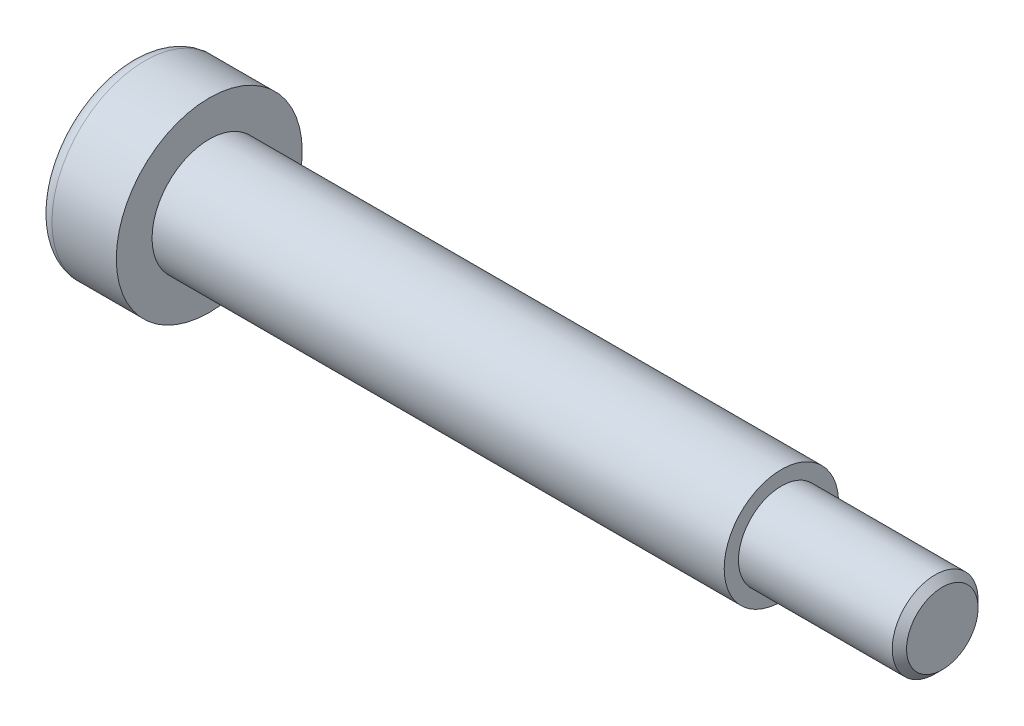
ISO-10303-21;
HEADER;
FILE_DESCRIPTION(('STEP AP214'),'2;1');
FILE_NAME('part.step','',(''),(''),'','','');
FILE_SCHEMA(('AUTOMOTIVE_DESIGN { 1 0 10303 214 1 1 1 1 }'));
ENDSEC;
DATA;
#1=APPLICATION_CONTEXT('core data for automotive mechanical design processes');
#2=APPLICATION_PROTOCOL_DEFINITION('international standard','automotive_design',2000,#1);
#3=PRODUCT_CONTEXT('',#1,'mechanical');
#4=PRODUCT('Part','Part','',(#3));
#5=PRODUCT_RELATED_PRODUCT_CATEGORY('part','',(#4));
#6=PRODUCT_DEFINITION_FORMATION('','',#4);
#7=PRODUCT_DEFINITION_CONTEXT('part definition',#1,'design');
#8=PRODUCT_DEFINITION('design','',#6,#7);
#9=PRODUCT_DEFINITION_SHAPE('','',#8);
#10=(LENGTH_UNIT() NAMED_UNIT(*) SI_UNIT(.MILLI.,.METRE.));
#11=(NAMED_UNIT(*) PLANE_ANGLE_UNIT() SI_UNIT($,.RADIAN.));
#12=(NAMED_UNIT(*) SI_UNIT($,.STERADIAN.) SOLID_ANGLE_UNIT());
#13=UNCERTAINTY_MEASURE_WITH_UNIT(LENGTH_MEASURE(1.E-05),#10,'distance_accuracy_value','');
#14=(GEOMETRIC_REPRESENTATION_CONTEXT(3) GLOBAL_UNCERTAINTY_ASSIGNED_CONTEXT((#13)) GLOBAL_UNIT_ASSIGNED_CONTEXT((#10,
#11,#12)) REPRESENTATION_CONTEXT('',''));
#15=CARTESIAN_POINT('',(0.,0.,0.));
#16=DIRECTION('',(0.,0.,1.));
#17=DIRECTION('',(1.,0.,0.));
#18=AXIS2_PLACEMENT_3D('',#15,#16,#17);
#19=CARTESIAN_POINT('',(0.,0.,0.));
#20=DIRECTION('',(1.,0.,0.));
#21=DIRECTION('',(0.,0.,-1.));
#22=AXIS2_PLACEMENT_3D('',#19,#20,#21);
#23=PLANE('',#22);
#24=CARTESIAN_POINT('',(0.,0.,0.));
#25=DIRECTION('',(1.,0.,0.));
#26=DIRECTION('',(0.,0.,-1.));
#27=AXIS2_PLACEMENT_3D('',#24,#25,#26);
#28=CIRCLE('',#27,5.5);
#29=CARTESIAN_POINT('',(0.,0.,-5.5));
#30=VERTEX_POINT('',#29);
#31=EDGE_CURVE('E164',#30,#30,#28,.F.);
#32=ORIENTED_EDGE('',*,*,#31,.T.);
#33=EDGE_LOOP('',(#32));
#34=FACE_BOUND('',#33,.T.);
#35=DIRECTION('',(0.,-0.5,-0.866025403784439));
#36=VECTOR('',#35,1.);
#37=CARTESIAN_POINT('',(0.,2.3094010767585,0.));
#38=LINE('',#37,#36);
#39=CARTESIAN_POINT('',(0.,2.3094010767585,0.));
#40=VERTEX_POINT('',#39);
#41=CARTESIAN_POINT('',(0.,1.15470053837925,-2.));
#42=VERTEX_POINT('',#41);
#43=EDGE_CURVE('E134',#40,#42,#38,.T.);
#44=ORIENTED_EDGE('',*,*,#43,.F.);
#45=DIRECTION('',(0.,0.5,-0.866025403784439));
#46=VECTOR('',#45,1.);
#47=CARTESIAN_POINT('',(0.,1.15470053837925,2.));
#48=LINE('',#47,#46);
#49=CARTESIAN_POINT('',(0.,1.15470053837925,2.));
#50=VERTEX_POINT('',#49);
#51=EDGE_CURVE('E60',#50,#40,#48,.T.);
#52=ORIENTED_EDGE('',*,*,#51,.F.);
#53=DIRECTION('',(0.,1.,0.));
#54=VECTOR('',#53,1.);
#55=CARTESIAN_POINT('',(0.,-1.15470053837925,2.));
#56=LINE('',#55,#54);
#57=CARTESIAN_POINT('',(0.,-1.15470053837925,2.));
#58=VERTEX_POINT('',#57);
#59=EDGE_CURVE('E143',#58,#50,#56,.T.);
#60=ORIENTED_EDGE('',*,*,#59,.F.);
#61=DIRECTION('',(0.,0.5,0.866025403784439));
#62=VECTOR('',#61,1.);
#63=CARTESIAN_POINT('',(0.,-2.3094010767585,0.));
#64=LINE('',#63,#62);
#65=CARTESIAN_POINT('',(0.,-2.3094010767585,0.));
#66=VERTEX_POINT('',#65);
#67=EDGE_CURVE('E141',#66,#58,#64,.T.);
#68=ORIENTED_EDGE('',*,*,#67,.F.);
#69=DIRECTION('',(0.,-0.5,0.866025403784439));
#70=VECTOR('',#69,1.);
#71=CARTESIAN_POINT('',(0.,-1.15470053837925,-2.));
#72=LINE('',#71,#70);
#73=CARTESIAN_POINT('',(0.,-1.15470053837925,-2.));
#74=VERTEX_POINT('',#73);
#75=EDGE_CURVE('E108',#74,#66,#72,.T.);
#76=ORIENTED_EDGE('',*,*,#75,.F.);
#77=DIRECTION('',(0.,-1.,0.));
#78=VECTOR('',#77,1.);
#79=CARTESIAN_POINT('',(0.,1.15470053837925,-2.));
#80=LINE('',#79,#78);
#81=EDGE_CURVE('E137',#42,#74,#80,.T.);
#82=ORIENTED_EDGE('',*,*,#81,.F.);
#83=EDGE_LOOP('',(#44,#52,#60,#68,#76,#82));
#84=FACE_BOUND('',#83,.T.);
#85=ADVANCED_FACE('F45',(#34,#84),#23,.F.);
#86=CARTESIAN_POINT('',(0.,0.,0.));
#87=DIRECTION('',(-1.,0.,0.));
#88=DIRECTION('',(0.,0.,1.));
#89=AXIS2_PLACEMENT_3D('',#86,#87,#88);
#90=CYLINDRICAL_SURFACE('',#89,6.5);
#91=CARTESIAN_POINT('',(1.,0.,0.));
#92=DIRECTION('',(1.,0.,0.));
#93=DIRECTION('',(0.,0.,-1.));
#94=AXIS2_PLACEMENT_3D('',#91,#92,#93);
#95=CIRCLE('',#94,6.5);
#96=CARTESIAN_POINT('',(1.,0.,-6.5));
#97=VERTEX_POINT('',#96);
#98=EDGE_CURVE('E167',#97,#97,#95,.T.);
#99=ORIENTED_EDGE('',*,*,#98,.T.);
#100=EDGE_LOOP('',(#99));
#101=FACE_BOUND('',#100,.T.);
#102=CARTESIAN_POINT('',(5.5,0.,0.));
#103=DIRECTION('',(-1.,0.,0.));
#104=DIRECTION('',(0.,0.,1.));
#105=AXIS2_PLACEMENT_3D('',#102,#103,#104);
#106=CIRCLE('',#105,6.5);
#107=CARTESIAN_POINT('',(5.5,0.,6.5));
#108=VERTEX_POINT('',#107);
#109=EDGE_CURVE('E161',#108,#108,#106,.T.);
#110=ORIENTED_EDGE('',*,*,#109,.T.);
#111=EDGE_LOOP('',(#110));
#112=FACE_BOUND('',#111,.T.);
#113=ADVANCED_FACE('F185',(#101,#112),#90,.T.);
#114=CARTESIAN_POINT('',(5.5,6.5,0.));
#115=DIRECTION('',(-1.,0.,0.));
#116=DIRECTION('',(0.,0.,1.));
#117=AXIS2_PLACEMENT_3D('',#114,#115,#116);
#118=PLANE('',#117);
#119=ORIENTED_EDGE('',*,*,#109,.F.);
#120=EDGE_LOOP('',(#119));
#121=FACE_BOUND('',#120,.T.);
#122=CARTESIAN_POINT('',(5.5,0.,0.));
#123=DIRECTION('',(-1.,0.,0.));
#124=DIRECTION('',(0.,0.,1.));
#125=AXIS2_PLACEMENT_3D('',#122,#123,#124);
#126=CIRCLE('',#125,4.);
#127=CARTESIAN_POINT('',(5.5,0.,4.));
#128=VERTEX_POINT('',#127);
#129=EDGE_CURVE('E158',#128,#128,#126,.T.);
#130=ORIENTED_EDGE('',*,*,#129,.T.);
#131=EDGE_LOOP('',(#130));
#132=FACE_BOUND('',#131,.T.);
#133=ADVANCED_FACE('F192',(#121,#132),#118,.F.);
#134=CARTESIAN_POINT('',(0.,0.,0.));
#135=DIRECTION('',(-1.,0.,0.));
#136=DIRECTION('',(0.,0.,1.));
#137=AXIS2_PLACEMENT_3D('',#134,#135,#136);
#138=CYLINDRICAL_SURFACE('',#137,4.);
#139=ORIENTED_EDGE('',*,*,#129,.F.);
#140=EDGE_LOOP('',(#139));
#141=FACE_BOUND('',#140,.T.);
#142=CARTESIAN_POINT('',(45.5,0.,0.));
#143=DIRECTION('',(-1.,0.,0.));
#144=DIRECTION('',(0.,0.,1.));
#145=AXIS2_PLACEMENT_3D('',#142,#143,#144);
#146=CIRCLE('',#145,4.);
#147=CARTESIAN_POINT('',(45.5,0.,4.));
#148=VERTEX_POINT('',#147);
#149=EDGE_CURVE('E155',#148,#148,#146,.T.);
#150=ORIENTED_EDGE('',*,*,#149,.T.);
#151=EDGE_LOOP('',(#150));
#152=FACE_BOUND('',#151,.T.);
#153=ADVANCED_FACE('F199',(#141,#152),#138,.T.);
#154=CARTESIAN_POINT('',(45.5,4.,0.));
#155=DIRECTION('',(-1.,0.,0.));
#156=DIRECTION('',(0.,0.,1.));
#157=AXIS2_PLACEMENT_3D('',#154,#155,#156);
#158=PLANE('',#157);
#159=ORIENTED_EDGE('',*,*,#149,.F.);
#160=EDGE_LOOP('',(#159));
#161=FACE_BOUND('',#160,.T.);
#162=CARTESIAN_POINT('',(45.5,0.,0.));
#163=DIRECTION('',(-1.,0.,0.));
#164=DIRECTION('',(0.,0.,1.));
#165=AXIS2_PLACEMENT_3D('',#162,#163,#164);
#166=CIRCLE('',#165,3.);
#167=CARTESIAN_POINT('',(45.5,0.,3.));
#168=VERTEX_POINT('',#167);
#169=EDGE_CURVE('E147',#168,#168,#166,.T.);
#170=ORIENTED_EDGE('',*,*,#169,.T.);
#171=EDGE_LOOP('',(#170));
#172=FACE_BOUND('',#171,.T.);
#173=ADVANCED_FACE('F203',(#161,#172),#158,.F.);
#174=CARTESIAN_POINT('',(0.,0.,0.));
#175=DIRECTION('',(-1.,0.,0.));
#176=DIRECTION('',(0.,0.,1.));
#177=AXIS2_PLACEMENT_3D('',#174,#175,#176);
#178=CYLINDRICAL_SURFACE('',#177,3.);
#179=CARTESIAN_POINT('',(56.25,0.,0.));
#180=DIRECTION('',(-1.,0.,0.));
#181=DIRECTION('',(0.,0.,1.));
#182=AXIS2_PLACEMENT_3D('',#179,#180,#181);
#183=CIRCLE('',#182,3.);
#184=CARTESIAN_POINT('',(56.25,0.,3.));
#185=VERTEX_POINT('',#184);
#186=EDGE_CURVE('E53',#185,#185,#183,.T.);
#187=ORIENTED_EDGE('',*,*,#186,.T.);
#188=EDGE_LOOP('',(#187));
#189=FACE_BOUND('',#188,.T.);
#190=ORIENTED_EDGE('',*,*,#169,.F.);
#191=EDGE_LOOP('',(#190));
#192=FACE_BOUND('',#191,.T.);
#193=ADVANCED_FACE('F172',(#189,#192),#178,.T.);
#194=CARTESIAN_POINT('',(56.75,3.,0.));
#195=DIRECTION('',(-1.,0.,0.));
#196=DIRECTION('',(0.,0.,1.));
#197=AXIS2_PLACEMENT_3D('',#194,#195,#196);
#198=PLANE('',#197);
#199=CARTESIAN_POINT('',(56.75,0.,0.));
#200=DIRECTION('',(-1.,0.,0.));
#201=DIRECTION('',(0.,0.,1.));
#202=AXIS2_PLACEMENT_3D('',#199,#200,#201);
#203=CIRCLE('',#202,2.5);
#204=CARTESIAN_POINT('',(56.75,0.,2.5));
#205=VERTEX_POINT('',#204);
#206=EDGE_CURVE('E11',#205,#205,#203,.F.);
#207=ORIENTED_EDGE('',*,*,#206,.T.);
#208=EDGE_LOOP('',(#207));
#209=FACE_BOUND('',#208,.T.);
#210=ADVANCED_FACE('F210',(#209),#198,.F.);
#211=CARTESIAN_POINT('',(3.3,1.15470053837925,2.));
#212=DIRECTION('',(0.,0.866025403784439,0.5));
#213=DIRECTION('',(0.,-0.5,0.866025403784439));
#214=AXIS2_PLACEMENT_3D('',#211,#212,#213);
#215=PLANE('',#214);
#216=ORIENTED_EDGE('',*,*,#51,.T.);
#217=DIRECTION('',(-1.,0.,0.));
#218=VECTOR('',#217,1.);
#219=CARTESIAN_POINT('',(3.3,2.3094010767585,0.));
#220=LINE('',#219,#218);
#221=CARTESIAN_POINT('',(3.3,2.3094010767585,0.));
#222=VERTEX_POINT('',#221);
#223=EDGE_CURVE('E90',#222,#40,#220,.T.);
#224=ORIENTED_EDGE('',*,*,#223,.F.);
#225=DIRECTION('',(0.,0.5,-0.866025403784439));
#226=VECTOR('',#225,1.);
#227=CARTESIAN_POINT('',(3.3,1.15470053837925,2.));
#228=LINE('',#227,#226);
#229=CARTESIAN_POINT('',(3.3,1.15470053837925,2.));
#230=VERTEX_POINT('',#229);
#231=EDGE_CURVE('E145',#230,#222,#228,.T.);
#232=ORIENTED_EDGE('',*,*,#231,.F.);
#233=DIRECTION('',(-1.,0.,0.));
#234=VECTOR('',#233,1.);
#235=CARTESIAN_POINT('',(3.3,1.15470053837925,2.));
#236=LINE('',#235,#234);
#237=EDGE_CURVE('E68',#230,#50,#236,.T.);
#238=ORIENTED_EDGE('',*,*,#237,.T.);
#239=EDGE_LOOP('',(#216,#224,#232,#238));
#240=FACE_BOUND('',#239,.T.);
#241=ADVANCED_FACE('F212',(#240),#215,.F.);
#242=CARTESIAN_POINT('',(3.3,-1.15470053837925,2.));
#243=DIRECTION('',(0.,0.,1.));
#244=DIRECTION('',(0.,-1.,0.));
#245=AXIS2_PLACEMENT_3D('',#242,#243,#244);
#246=PLANE('',#245);
#247=ORIENTED_EDGE('',*,*,#59,.T.);
#248=ORIENTED_EDGE('',*,*,#237,.F.);
#249=DIRECTION('',(0.,1.,0.));
#250=VECTOR('',#249,1.);
#251=CARTESIAN_POINT('',(3.3,-1.15470053837925,2.));
#252=LINE('',#251,#250);
#253=CARTESIAN_POINT('',(3.3,-1.15470053837925,2.));
#254=VERTEX_POINT('',#253);
#255=EDGE_CURVE('E120',#254,#230,#252,.T.);
#256=ORIENTED_EDGE('',*,*,#255,.F.);
#257=DIRECTION('',(-1.,0.,0.));
#258=VECTOR('',#257,1.);
#259=CARTESIAN_POINT('',(3.3,-1.15470053837925,2.));
#260=LINE('',#259,#258);
#261=EDGE_CURVE('E112',#254,#58,#260,.T.);
#262=ORIENTED_EDGE('',*,*,#261,.T.);
#263=EDGE_LOOP('',(#247,#248,#256,#262));
#264=FACE_BOUND('',#263,.T.);
#265=ADVANCED_FACE('F216',(#264),#246,.F.);
#266=CARTESIAN_POINT('',(3.3,-2.3094010767585,0.));
#267=DIRECTION('',(0.,-0.866025403784439,0.5));
#268=DIRECTION('',(0.,-0.5,-0.866025403784439));
#269=AXIS2_PLACEMENT_3D('',#266,#267,#268);
#270=PLANE('',#269);
#271=ORIENTED_EDGE('',*,*,#67,.T.);
#272=ORIENTED_EDGE('',*,*,#261,.F.);
#273=DIRECTION('',(0.,0.5,0.866025403784439));
#274=VECTOR('',#273,1.);
#275=CARTESIAN_POINT('',(3.3,-2.3094010767585,0.));
#276=LINE('',#275,#274);
#277=CARTESIAN_POINT('',(3.3,-2.3094010767585,0.));
#278=VERTEX_POINT('',#277);
#279=EDGE_CURVE('E116',#278,#254,#276,.T.);
#280=ORIENTED_EDGE('',*,*,#279,.F.);
#281=DIRECTION('',(-1.,0.,0.));
#282=VECTOR('',#281,1.);
#283=CARTESIAN_POINT('',(3.3,-2.3094010767585,0.));
#284=LINE('',#283,#282);
#285=EDGE_CURVE('E101',#278,#66,#284,.T.);
#286=ORIENTED_EDGE('',*,*,#285,.T.);
#287=EDGE_LOOP('',(#271,#272,#280,#286));
#288=FACE_BOUND('',#287,.T.);
#289=ADVANCED_FACE('F117',(#288),#270,.F.);
#290=CARTESIAN_POINT('',(3.3,-1.15470053837925,-2.));
#291=DIRECTION('',(0.,-0.866025403784438,-0.5));
#292=DIRECTION('',(0.,0.5,-0.866025403784439));
#293=AXIS2_PLACEMENT_3D('',#290,#291,#292);
#294=PLANE('',#293);
#295=ORIENTED_EDGE('',*,*,#75,.T.);
#296=ORIENTED_EDGE('',*,*,#285,.F.);
#297=DIRECTION('',(0.,-0.5,0.866025403784439));
#298=VECTOR('',#297,1.);
#299=CARTESIAN_POINT('',(3.3,-1.15470053837925,-2.));
#300=LINE('',#299,#298);
#301=CARTESIAN_POINT('',(3.3,-1.15470053837925,-2.));
#302=VERTEX_POINT('',#301);
#303=EDGE_CURVE('E105',#302,#278,#300,.T.);
#304=ORIENTED_EDGE('',*,*,#303,.F.);
#305=DIRECTION('',(-1.,0.,0.));
#306=VECTOR('',#305,1.);
#307=CARTESIAN_POINT('',(3.3,-1.15470053837925,-2.));
#308=LINE('',#307,#306);
#309=EDGE_CURVE('E113',#302,#74,#308,.T.);
#310=ORIENTED_EDGE('',*,*,#309,.T.);
#311=EDGE_LOOP('',(#295,#296,#304,#310));
#312=FACE_BOUND('',#311,.T.);
#313=ADVANCED_FACE('F103',(#312),#294,.F.);
#314=CARTESIAN_POINT('',(3.3,1.15470053837925,-2.));
#315=DIRECTION('',(0.,0.,-1.));
#316=DIRECTION('',(-1.,0.,0.));
#317=AXIS2_PLACEMENT_3D('',#314,#315,#316);
#318=PLANE('',#317);
#319=ORIENTED_EDGE('',*,*,#81,.T.);
#320=ORIENTED_EDGE('',*,*,#309,.F.);
#321=DIRECTION('',(0.,-1.,0.));
#322=VECTOR('',#321,1.);
#323=CARTESIAN_POINT('',(3.3,1.15470053837925,-2.));
#324=LINE('',#323,#322);
#325=CARTESIAN_POINT('',(3.3,1.15470053837925,-2.));
#326=VERTEX_POINT('',#325);
#327=EDGE_CURVE('E126',#326,#302,#324,.T.);
#328=ORIENTED_EDGE('',*,*,#327,.F.);
#329=DIRECTION('',(-1.,0.,0.));
#330=VECTOR('',#329,1.);
#331=CARTESIAN_POINT('',(3.3,1.15470053837925,-2.));
#332=LINE('',#331,#330);
#333=EDGE_CURVE('E150',#326,#42,#332,.T.);
#334=ORIENTED_EDGE('',*,*,#333,.T.);
#335=EDGE_LOOP('',(#319,#320,#328,#334));
#336=FACE_BOUND('',#335,.T.);
#337=ADVANCED_FACE('F220',(#336),#318,.F.);
#338=CARTESIAN_POINT('',(3.3,2.3094010767585,0.));
#339=DIRECTION('',(0.,0.866025403784439,-0.5));
#340=DIRECTION('',(0.,0.5,0.866025403784439));
#341=AXIS2_PLACEMENT_3D('',#338,#339,#340);
#342=PLANE('',#341);
#343=ORIENTED_EDGE('',*,*,#43,.T.);
#344=ORIENTED_EDGE('',*,*,#333,.F.);
#345=DIRECTION('',(0.,-0.5,-0.866025403784439));
#346=VECTOR('',#345,1.);
#347=CARTESIAN_POINT('',(3.3,2.3094010767585,0.));
#348=LINE('',#347,#346);
#349=EDGE_CURVE('E128',#222,#326,#348,.T.);
#350=ORIENTED_EDGE('',*,*,#349,.F.);
#351=ORIENTED_EDGE('',*,*,#223,.T.);
#352=EDGE_LOOP('',(#343,#344,#350,#351));
#353=FACE_BOUND('',#352,.T.);
#354=ADVANCED_FACE('F217',(#353),#342,.F.);
#355=CARTESIAN_POINT('',(3.3,0.,0.));
#356=DIRECTION('',(-1.,0.,0.));
#357=DIRECTION('',(0.,0.,1.));
#358=AXIS2_PLACEMENT_3D('',#355,#356,#357);
#359=PLANE('',#358);
#360=ORIENTED_EDGE('',*,*,#231,.T.);
#361=ORIENTED_EDGE('',*,*,#349,.T.);
#362=ORIENTED_EDGE('',*,*,#327,.T.);
#363=ORIENTED_EDGE('',*,*,#303,.T.);
#364=ORIENTED_EDGE('',*,*,#279,.T.);
#365=ORIENTED_EDGE('',*,*,#255,.T.);
#366=EDGE_LOOP('',(#360,#361,#362,#363,#364,#365));
#367=FACE_BOUND('',#366,.T.);
#368=ADVANCED_FACE('F123',(#367),#359,.T.);
#369=CARTESIAN_POINT('',(1.,0.,0.));
#370=DIRECTION('',(1.,0.,0.));
#371=DIRECTION('',(0.,0.,-1.));
#372=AXIS2_PLACEMENT_3D('',#369,#370,#371);
#373=TOROIDAL_SURFACE('',#372,5.5,1.);
#374=ORIENTED_EDGE('',*,*,#98,.F.);
#375=EDGE_LOOP('',(#374));
#376=FACE_BOUND('',#375,.T.);
#377=ORIENTED_EDGE('',*,*,#31,.F.);
#378=EDGE_LOOP('',(#377));
#379=FACE_BOUND('',#378,.T.);
#380=ADVANCED_FACE('F176',(#376,#379),#373,.T.);
#381=CARTESIAN_POINT('',(56.25,0.,0.));
#382=DIRECTION('',(-1.,0.,0.));
#383=DIRECTION('',(0.,0.,1.));
#384=AXIS2_PLACEMENT_3D('',#381,#382,#383);
#385=CONICAL_SURFACE('',#384,3.,0.785398163397446);
#386=ORIENTED_EDGE('',*,*,#206,.F.);
#387=EDGE_LOOP('',(#386));
#388=FACE_BOUND('',#387,.T.);
#389=ORIENTED_EDGE('',*,*,#186,.F.);
#390=EDGE_LOOP('',(#389));
#391=FACE_BOUND('',#390,.T.);
#392=ADVANCED_FACE('F47',(#388,#391),#385,.T.);
#393=CLOSED_SHELL('',(#85,#113,#133,#153,#173,#193,#210,#241,#265,#289,#313,#337,#354,#368,#380,#392));
#394=MANIFOLD_SOLID_BREP('B2',#393);
#395=ADVANCED_BREP_SHAPE_REPRESENTATION('',(#18,#394),#14);
#396=SHAPE_DEFINITION_REPRESENTATION(#9,#395);
ENDSEC;
END-ISO-10303-21;
